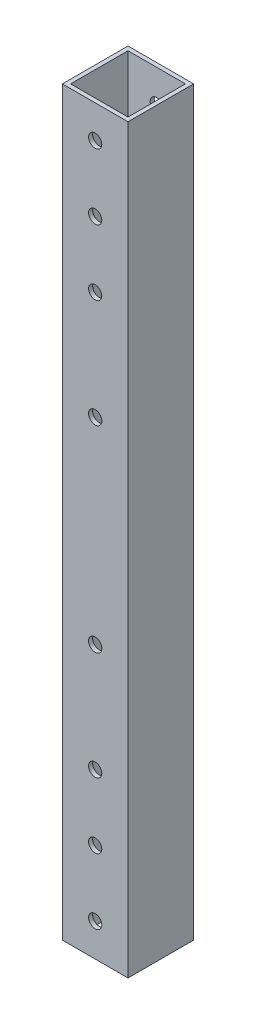
ISO-10303-21;
HEADER;
FILE_DESCRIPTION(('STEP AP214'),'2;1');
FILE_NAME('part.step','',(''),(''),'','','');
FILE_SCHEMA(('AUTOMOTIVE_DESIGN { 1 0 10303 214 1 1 1 1 }'));
ENDSEC;
DATA;
#1=APPLICATION_CONTEXT('core data for automotive mechanical design processes');
#2=APPLICATION_PROTOCOL_DEFINITION('international standard','automotive_design',2000,#1);
#3=PRODUCT_CONTEXT('',#1,'mechanical');
#4=PRODUCT('Part','Part','',(#3));
#5=PRODUCT_RELATED_PRODUCT_CATEGORY('part','',(#4));
#6=PRODUCT_DEFINITION_FORMATION('','',#4);
#7=PRODUCT_DEFINITION_CONTEXT('part definition',#1,'design');
#8=PRODUCT_DEFINITION('design','',#6,#7);
#9=PRODUCT_DEFINITION_SHAPE('','',#8);
#10=(LENGTH_UNIT() NAMED_UNIT(*) SI_UNIT(.MILLI.,.METRE.));
#11=(NAMED_UNIT(*) PLANE_ANGLE_UNIT() SI_UNIT($,.RADIAN.));
#12=(NAMED_UNIT(*) SI_UNIT($,.STERADIAN.) SOLID_ANGLE_UNIT());
#13=UNCERTAINTY_MEASURE_WITH_UNIT(LENGTH_MEASURE(1.E-05),#10,'distance_accuracy_value','');
#14=(GEOMETRIC_REPRESENTATION_CONTEXT(3) GLOBAL_UNCERTAINTY_ASSIGNED_CONTEXT((#13)) GLOBAL_UNIT_ASSIGNED_CONTEXT((#10,
#11,#12)) REPRESENTATION_CONTEXT('',''));
#15=CARTESIAN_POINT('',(0.,0.,0.));
#16=DIRECTION('',(0.,0.,1.));
#17=DIRECTION('',(1.,0.,0.));
#18=AXIS2_PLACEMENT_3D('',#15,#16,#17);
#19=CARTESIAN_POINT('',(0.,287.02,0.));
#20=DIRECTION('',(0.,1.,0.));
#21=DIRECTION('',(0.,0.,1.));
#22=AXIS2_PLACEMENT_3D('',#19,#20,#21);
#23=PLANE('',#22);
#24=DIRECTION('',(0.,0.,-1.));
#25=VECTOR('',#24,1.);
#26=CARTESIAN_POINT('',(12.7,287.02,-12.7));
#27=LINE('',#26,#25);
#28=CARTESIAN_POINT('',(12.7,287.02,12.7));
#29=VERTEX_POINT('',#28);
#30=CARTESIAN_POINT('',(12.7,287.02,-12.7));
#31=VERTEX_POINT('',#30);
#32=EDGE_CURVE('E145',#29,#31,#27,.T.);
#33=ORIENTED_EDGE('',*,*,#32,.T.);
#34=DIRECTION('',(-1.,0.,0.));
#35=VECTOR('',#34,1.);
#36=CARTESIAN_POINT('',(-12.7,287.02,-12.7));
#37=LINE('',#36,#35);
#38=CARTESIAN_POINT('',(-12.7,287.02,-12.7));
#39=VERTEX_POINT('',#38);
#40=EDGE_CURVE('E148',#31,#39,#37,.T.);
#41=ORIENTED_EDGE('',*,*,#40,.T.);
#42=DIRECTION('',(0.,0.,1.));
#43=VECTOR('',#42,1.);
#44=CARTESIAN_POINT('',(-12.7,287.02,-12.7));
#45=LINE('',#44,#43);
#46=CARTESIAN_POINT('',(-12.7,287.02,12.7));
#47=VERTEX_POINT('',#46);
#48=EDGE_CURVE('E151',#39,#47,#45,.T.);
#49=ORIENTED_EDGE('',*,*,#48,.T.);
#50=DIRECTION('',(1.,0.,0.));
#51=VECTOR('',#50,1.);
#52=CARTESIAN_POINT('',(-12.7,287.02,12.7));
#53=LINE('',#52,#51);
#54=EDGE_CURVE('E153',#47,#29,#53,.T.);
#55=ORIENTED_EDGE('',*,*,#54,.T.);
#56=EDGE_LOOP('',(#33,#41,#49,#55));
#57=FACE_BOUND('',#56,.T.);
#58=DIRECTION('',(-1.,0.,0.));
#59=VECTOR('',#58,1.);
#60=CARTESIAN_POINT('',(-11.1125,287.02,-11.1125));
#61=LINE('',#60,#59);
#62=CARTESIAN_POINT('',(11.1125,287.02,-11.1125));
#63=VERTEX_POINT('',#62);
#64=CARTESIAN_POINT('',(-11.1125,287.02,-11.1125));
#65=VERTEX_POINT('',#64);
#66=EDGE_CURVE('E115',#63,#65,#61,.T.);
#67=ORIENTED_EDGE('',*,*,#66,.F.);
#68=DIRECTION('',(0.,0.,-1.));
#69=VECTOR('',#68,1.);
#70=CARTESIAN_POINT('',(11.1125,287.02,-11.1125));
#71=LINE('',#70,#69);
#72=CARTESIAN_POINT('',(11.1125,287.02,11.1125));
#73=VERTEX_POINT('',#72);
#74=EDGE_CURVE('E107',#73,#63,#71,.T.);
#75=ORIENTED_EDGE('',*,*,#74,.F.);
#76=DIRECTION('',(1.,0.,0.));
#77=VECTOR('',#76,1.);
#78=CARTESIAN_POINT('',(-11.1125,287.02,11.1125));
#79=LINE('',#78,#77);
#80=CARTESIAN_POINT('',(-11.1125,287.02,11.1125));
#81=VERTEX_POINT('',#80);
#82=EDGE_CURVE('E129',#81,#73,#79,.T.);
#83=ORIENTED_EDGE('',*,*,#82,.F.);
#84=DIRECTION('',(0.,0.,1.));
#85=VECTOR('',#84,1.);
#86=CARTESIAN_POINT('',(-11.1125,287.02,-11.1125));
#87=LINE('',#86,#85);
#88=EDGE_CURVE('E127',#65,#81,#87,.T.);
#89=ORIENTED_EDGE('',*,*,#88,.F.);
#90=EDGE_LOOP('',(#67,#75,#83,#89));
#91=FACE_BOUND('',#90,.T.);
#92=ADVANCED_FACE('F40',(#57,#91),#23,.T.);
#93=CARTESIAN_POINT('',(0.,0.,0.));
#94=DIRECTION('',(0.,1.,0.));
#95=DIRECTION('',(0.,0.,1.));
#96=AXIS2_PLACEMENT_3D('',#93,#94,#95);
#97=PLANE('',#96);
#98=DIRECTION('',(0.,0.,-1.));
#99=VECTOR('',#98,1.);
#100=CARTESIAN_POINT('',(12.7,0.,-12.7));
#101=LINE('',#100,#99);
#102=CARTESIAN_POINT('',(12.7,0.,12.7));
#103=VERTEX_POINT('',#102);
#104=CARTESIAN_POINT('',(12.7,0.,-12.7));
#105=VERTEX_POINT('',#104);
#106=EDGE_CURVE('E123',#103,#105,#101,.T.);
#107=ORIENTED_EDGE('',*,*,#106,.F.);
#108=DIRECTION('',(1.,0.,0.));
#109=VECTOR('',#108,1.);
#110=CARTESIAN_POINT('',(-12.7,0.,12.7));
#111=LINE('',#110,#109);
#112=CARTESIAN_POINT('',(-12.7,0.,12.7));
#113=VERTEX_POINT('',#112);
#114=EDGE_CURVE('E149',#113,#103,#111,.T.);
#115=ORIENTED_EDGE('',*,*,#114,.F.);
#116=DIRECTION('',(0.,0.,1.));
#117=VECTOR('',#116,1.);
#118=CARTESIAN_POINT('',(-12.7,0.,-12.7));
#119=LINE('',#118,#117);
#120=CARTESIAN_POINT('',(-12.7,0.,-12.7));
#121=VERTEX_POINT('',#120);
#122=EDGE_CURVE('E160',#121,#113,#119,.T.);
#123=ORIENTED_EDGE('',*,*,#122,.F.);
#124=DIRECTION('',(-1.,0.,0.));
#125=VECTOR('',#124,1.);
#126=CARTESIAN_POINT('',(-12.7,0.,-12.7));
#127=LINE('',#126,#125);
#128=EDGE_CURVE('E158',#105,#121,#127,.T.);
#129=ORIENTED_EDGE('',*,*,#128,.F.);
#130=EDGE_LOOP('',(#107,#115,#123,#129));
#131=FACE_BOUND('',#130,.T.);
#132=DIRECTION('',(0.,0.,-1.));
#133=VECTOR('',#132,1.);
#134=CARTESIAN_POINT('',(11.1125,0.,-11.1125));
#135=LINE('',#134,#133);
#136=CARTESIAN_POINT('',(11.1125,0.,11.1125));
#137=VERTEX_POINT('',#136);
#138=CARTESIAN_POINT('',(11.1125,0.,-11.1125));
#139=VERTEX_POINT('',#138);
#140=EDGE_CURVE('E65',#137,#139,#135,.T.);
#141=ORIENTED_EDGE('',*,*,#140,.T.);
#142=DIRECTION('',(-1.,0.,0.));
#143=VECTOR('',#142,1.);
#144=CARTESIAN_POINT('',(-11.1125,0.,-11.1125));
#145=LINE('',#144,#143);
#146=CARTESIAN_POINT('',(-11.1125,0.,-11.1125));
#147=VERTEX_POINT('',#146);
#148=EDGE_CURVE('E122',#139,#147,#145,.T.);
#149=ORIENTED_EDGE('',*,*,#148,.T.);
#150=DIRECTION('',(0.,0.,1.));
#151=VECTOR('',#150,1.);
#152=CARTESIAN_POINT('',(-11.1125,0.,-11.1125));
#153=LINE('',#152,#151);
#154=CARTESIAN_POINT('',(-11.1125,0.,11.1125));
#155=VERTEX_POINT('',#154);
#156=EDGE_CURVE('E137',#147,#155,#153,.T.);
#157=ORIENTED_EDGE('',*,*,#156,.T.);
#158=DIRECTION('',(1.,0.,0.));
#159=VECTOR('',#158,1.);
#160=CARTESIAN_POINT('',(-11.1125,0.,11.1125));
#161=LINE('',#160,#159);
#162=EDGE_CURVE('E116',#155,#137,#161,.T.);
#163=ORIENTED_EDGE('',*,*,#162,.T.);
#164=EDGE_LOOP('',(#141,#149,#157,#163));
#165=FACE_BOUND('',#164,.T.);
#166=ADVANCED_FACE('F277',(#131,#165),#97,.F.);
#167=CARTESIAN_POINT('',(12.7,287.02,-12.7));
#168=DIRECTION('',(-1.,0.,0.));
#169=DIRECTION('',(0.,0.,1.));
#170=AXIS2_PLACEMENT_3D('',#167,#168,#169);
#171=PLANE('',#170);
#172=ORIENTED_EDGE('',*,*,#106,.T.);
#173=DIRECTION('',(0.,-1.,0.));
#174=VECTOR('',#173,1.);
#175=CARTESIAN_POINT('',(12.7,287.02,-12.7));
#176=LINE('',#175,#174);
#177=EDGE_CURVE('E11',#31,#105,#176,.T.);
#178=ORIENTED_EDGE('',*,*,#177,.F.);
#179=ORIENTED_EDGE('',*,*,#32,.F.);
#180=DIRECTION('',(0.,-1.,0.));
#181=VECTOR('',#180,1.);
#182=CARTESIAN_POINT('',(12.7,287.02,12.7));
#183=LINE('',#182,#181);
#184=EDGE_CURVE('E155',#29,#103,#183,.T.);
#185=ORIENTED_EDGE('',*,*,#184,.T.);
#186=EDGE_LOOP('',(#172,#178,#179,#185));
#187=FACE_BOUND('',#186,.T.);
#188=ADVANCED_FACE('F42',(#187),#171,.F.);
#189=CARTESIAN_POINT('',(-12.7,287.02,-12.7));
#190=DIRECTION('',(0.,0.,1.));
#191=DIRECTION('',(1.,0.,0.));
#192=AXIS2_PLACEMENT_3D('',#189,#190,#191);
#193=PLANE('',#192);
#194=CARTESIAN_POINT('',(1.11022302462516E-13,105.41,-12.7));
#195=DIRECTION('',(0.,0.,-1.));
#196=DIRECTION('',(-1.,0.,0.));
#197=AXIS2_PLACEMENT_3D('',#194,#195,#196);
#198=CIRCLE('',#197,2.57975099999999);
#199=CARTESIAN_POINT('',(-2.57975099999988,105.41,-12.7));
#200=VERTEX_POINT('',#199);
#201=EDGE_CURVE('E302',#200,#200,#198,.T.);
#202=ORIENTED_EDGE('',*,*,#201,.F.);
#203=EDGE_LOOP('',(#202));
#204=FACE_BOUND('',#203,.T.);
#205=CARTESIAN_POINT('',(1.11022302462516E-13,181.61,-12.7));
#206=DIRECTION('',(0.,0.,-1.));
#207=DIRECTION('',(-1.,0.,0.));
#208=AXIS2_PLACEMENT_3D('',#205,#206,#207);
#209=CIRCLE('',#208,2.57975099999999);
#210=CARTESIAN_POINT('',(-2.57975099999988,181.61,-12.7));
#211=VERTEX_POINT('',#210);
#212=EDGE_CURVE('E208',#211,#211,#209,.T.);
#213=ORIENTED_EDGE('',*,*,#212,.F.);
#214=EDGE_LOOP('',(#213));
#215=FACE_BOUND('',#214,.T.);
#216=CARTESIAN_POINT('',(0.,274.32,-12.7));
#217=DIRECTION('',(0.,0.,1.));
#218=DIRECTION('',(1.,0.,0.));
#219=AXIS2_PLACEMENT_3D('',#216,#217,#218);
#220=CIRCLE('',#219,2.5527);
#221=CARTESIAN_POINT('',(2.55269999999995,274.32,-12.7));
#222=VERTEX_POINT('',#221);
#223=EDGE_CURVE('E197',#222,#222,#220,.T.);
#224=ORIENTED_EDGE('',*,*,#223,.T.);
#225=EDGE_LOOP('',(#224));
#226=FACE_BOUND('',#225,.T.);
#227=CARTESIAN_POINT('',(0.,248.92,-12.7));
#228=DIRECTION('',(0.,0.,1.));
#229=DIRECTION('',(1.,0.,0.));
#230=AXIS2_PLACEMENT_3D('',#227,#228,#229);
#231=CIRCLE('',#230,2.5527);
#232=CARTESIAN_POINT('',(2.55269999999994,248.92,-12.7));
#233=VERTEX_POINT('',#232);
#234=EDGE_CURVE('E193',#233,#233,#231,.T.);
#235=ORIENTED_EDGE('',*,*,#234,.T.);
#236=EDGE_LOOP('',(#235));
#237=FACE_BOUND('',#236,.T.);
#238=CARTESIAN_POINT('',(0.,223.52,-12.7));
#239=DIRECTION('',(0.,0.,1.));
#240=DIRECTION('',(1.,0.,0.));
#241=AXIS2_PLACEMENT_3D('',#238,#239,#240);
#242=CIRCLE('',#241,2.5527);
#243=CARTESIAN_POINT('',(2.55269999999994,223.52,-12.7));
#244=VERTEX_POINT('',#243);
#245=EDGE_CURVE('E188',#244,#244,#242,.T.);
#246=ORIENTED_EDGE('',*,*,#245,.T.);
#247=EDGE_LOOP('',(#246));
#248=FACE_BOUND('',#247,.T.);
#249=CARTESIAN_POINT('',(0.,63.5,-12.7));
#250=DIRECTION('',(0.,0.,1.));
#251=DIRECTION('',(1.,0.,0.));
#252=AXIS2_PLACEMENT_3D('',#249,#250,#251);
#253=CIRCLE('',#252,2.5527);
#254=CARTESIAN_POINT('',(2.55270000000001,63.5,-12.7));
#255=VERTEX_POINT('',#254);
#256=EDGE_CURVE('E183',#255,#255,#253,.T.);
#257=ORIENTED_EDGE('',*,*,#256,.T.);
#258=EDGE_LOOP('',(#257));
#259=FACE_BOUND('',#258,.T.);
#260=CARTESIAN_POINT('',(0.,38.1,-12.7));
#261=DIRECTION('',(0.,0.,1.));
#262=DIRECTION('',(1.,0.,0.));
#263=AXIS2_PLACEMENT_3D('',#260,#261,#262);
#264=CIRCLE('',#263,2.5527);
#265=CARTESIAN_POINT('',(2.55270000000001,38.1,-12.7));
#266=VERTEX_POINT('',#265);
#267=EDGE_CURVE('E178',#266,#266,#264,.T.);
#268=ORIENTED_EDGE('',*,*,#267,.T.);
#269=EDGE_LOOP('',(#268));
#270=FACE_BOUND('',#269,.T.);
#271=CARTESIAN_POINT('',(0.,12.7,-12.7));
#272=DIRECTION('',(0.,0.,1.));
#273=DIRECTION('',(1.,0.,0.));
#274=AXIS2_PLACEMENT_3D('',#271,#272,#273);
#275=CIRCLE('',#274,2.5527);
#276=CARTESIAN_POINT('',(2.55270000000001,12.7,-12.7));
#277=VERTEX_POINT('',#276);
#278=EDGE_CURVE('E173',#277,#277,#275,.T.);
#279=ORIENTED_EDGE('',*,*,#278,.T.);
#280=EDGE_LOOP('',(#279));
#281=FACE_BOUND('',#280,.T.);
#282=ORIENTED_EDGE('',*,*,#128,.T.);
#283=DIRECTION('',(0.,-1.,0.));
#284=VECTOR('',#283,1.);
#285=CARTESIAN_POINT('',(-12.7,287.02,-12.7));
#286=LINE('',#285,#284);
#287=EDGE_CURVE('E49',#39,#121,#286,.T.);
#288=ORIENTED_EDGE('',*,*,#287,.F.);
#289=ORIENTED_EDGE('',*,*,#40,.F.);
#290=ORIENTED_EDGE('',*,*,#177,.T.);
#291=EDGE_LOOP('',(#282,#288,#289,#290));
#292=FACE_BOUND('',#291,.T.);
#293=ADVANCED_FACE('F291',(#204,#215,#226,#237,#248,#259,#270,#281,#292),#193,.F.);
#294=CARTESIAN_POINT('',(-12.7,287.02,-12.7));
#295=DIRECTION('',(1.,0.,0.));
#296=DIRECTION('',(0.,0.,-1.));
#297=AXIS2_PLACEMENT_3D('',#294,#295,#296);
#298=PLANE('',#297);
#299=ORIENTED_EDGE('',*,*,#122,.T.);
#300=DIRECTION('',(0.,-1.,0.));
#301=VECTOR('',#300,1.);
#302=CARTESIAN_POINT('',(-12.7,287.02,12.7));
#303=LINE('',#302,#301);
#304=EDGE_CURVE('E165',#47,#113,#303,.T.);
#305=ORIENTED_EDGE('',*,*,#304,.F.);
#306=ORIENTED_EDGE('',*,*,#48,.F.);
#307=ORIENTED_EDGE('',*,*,#287,.T.);
#308=EDGE_LOOP('',(#299,#305,#306,#307));
#309=FACE_BOUND('',#308,.T.);
#310=ADVANCED_FACE('F288',(#309),#298,.F.);
#311=CARTESIAN_POINT('',(-12.7,287.02,12.7));
#312=DIRECTION('',(0.,0.,-1.));
#313=DIRECTION('',(-1.,0.,0.));
#314=AXIS2_PLACEMENT_3D('',#311,#312,#313);
#315=PLANE('',#314);
#316=CARTESIAN_POINT('',(1.11022302462516E-13,105.41,12.7));
#317=DIRECTION('',(0.,0.,-1.));
#318=DIRECTION('',(-1.,0.,0.));
#319=AXIS2_PLACEMENT_3D('',#316,#317,#318);
#320=CIRCLE('',#319,2.57975099999993);
#321=CARTESIAN_POINT('',(-2.57975099999982,105.41,12.7));
#322=VERTEX_POINT('',#321);
#323=EDGE_CURVE('E385',#322,#322,#320,.T.);
#324=ORIENTED_EDGE('',*,*,#323,.T.);
#325=EDGE_LOOP('',(#324));
#326=FACE_BOUND('',#325,.T.);
#327=CARTESIAN_POINT('',(1.11022302462516E-13,181.61,12.7));
#328=DIRECTION('',(0.,0.,-1.));
#329=DIRECTION('',(-1.,0.,0.));
#330=AXIS2_PLACEMENT_3D('',#327,#328,#329);
#331=CIRCLE('',#330,2.57975099999993);
#332=CARTESIAN_POINT('',(-2.57975099999982,181.61,12.7));
#333=VERTEX_POINT('',#332);
#334=EDGE_CURVE('E201',#333,#333,#331,.T.);
#335=ORIENTED_EDGE('',*,*,#334,.T.);
#336=EDGE_LOOP('',(#335));
#337=FACE_BOUND('',#336,.T.);
#338=CARTESIAN_POINT('',(0.,274.32,12.7));
#339=DIRECTION('',(0.,0.,1.));
#340=DIRECTION('',(1.,0.,0.));
#341=AXIS2_PLACEMENT_3D('',#338,#339,#340);
#342=CIRCLE('',#341,2.55269999999999);
#343=CARTESIAN_POINT('',(2.55269999999994,274.32,12.7));
#344=VERTEX_POINT('',#343);
#345=EDGE_CURVE('E205',#344,#344,#342,.T.);
#346=ORIENTED_EDGE('',*,*,#345,.F.);
#347=EDGE_LOOP('',(#346));
#348=FACE_BOUND('',#347,.T.);
#349=CARTESIAN_POINT('',(0.,248.92,12.7));
#350=DIRECTION('',(0.,0.,1.));
#351=DIRECTION('',(1.,0.,0.));
#352=AXIS2_PLACEMENT_3D('',#349,#350,#351);
#353=CIRCLE('',#352,2.55269999999999);
#354=CARTESIAN_POINT('',(2.55269999999993,248.92,12.7));
#355=VERTEX_POINT('',#354);
#356=EDGE_CURVE('E223',#355,#355,#353,.T.);
#357=ORIENTED_EDGE('',*,*,#356,.F.);
#358=EDGE_LOOP('',(#357));
#359=FACE_BOUND('',#358,.T.);
#360=CARTESIAN_POINT('',(0.,223.52,12.7));
#361=DIRECTION('',(0.,0.,1.));
#362=DIRECTION('',(1.,0.,0.));
#363=AXIS2_PLACEMENT_3D('',#360,#361,#362);
#364=CIRCLE('',#363,2.55269999999999);
#365=CARTESIAN_POINT('',(2.55269999999993,223.52,12.7));
#366=VERTEX_POINT('',#365);
#367=EDGE_CURVE('E230',#366,#366,#364,.T.);
#368=ORIENTED_EDGE('',*,*,#367,.F.);
#369=EDGE_LOOP('',(#368));
#370=FACE_BOUND('',#369,.T.);
#371=CARTESIAN_POINT('',(0.,63.5,12.7));
#372=DIRECTION('',(0.,0.,1.));
#373=DIRECTION('',(1.,0.,0.));
#374=AXIS2_PLACEMENT_3D('',#371,#372,#373);
#375=CIRCLE('',#374,2.55269999999999);
#376=CARTESIAN_POINT('',(2.5527,63.5,12.7));
#377=VERTEX_POINT('',#376);
#378=EDGE_CURVE('E237',#377,#377,#375,.T.);
#379=ORIENTED_EDGE('',*,*,#378,.F.);
#380=EDGE_LOOP('',(#379));
#381=FACE_BOUND('',#380,.T.);
#382=CARTESIAN_POINT('',(0.,38.1,12.7));
#383=DIRECTION('',(0.,0.,1.));
#384=DIRECTION('',(1.,0.,0.));
#385=AXIS2_PLACEMENT_3D('',#382,#383,#384);
#386=CIRCLE('',#385,2.55269999999999);
#387=CARTESIAN_POINT('',(2.5527,38.1,12.7));
#388=VERTEX_POINT('',#387);
#389=EDGE_CURVE('E244',#388,#388,#386,.T.);
#390=ORIENTED_EDGE('',*,*,#389,.F.);
#391=EDGE_LOOP('',(#390));
#392=FACE_BOUND('',#391,.T.);
#393=CARTESIAN_POINT('',(0.,12.7,12.7));
#394=DIRECTION('',(0.,0.,1.));
#395=DIRECTION('',(1.,0.,0.));
#396=AXIS2_PLACEMENT_3D('',#393,#394,#395);
#397=CIRCLE('',#396,2.55269999999999);
#398=CARTESIAN_POINT('',(2.5527,12.7,12.7));
#399=VERTEX_POINT('',#398);
#400=EDGE_CURVE('E251',#399,#399,#397,.T.);
#401=ORIENTED_EDGE('',*,*,#400,.F.);
#402=EDGE_LOOP('',(#401));
#403=FACE_BOUND('',#402,.T.);
#404=ORIENTED_EDGE('',*,*,#114,.T.);
#405=ORIENTED_EDGE('',*,*,#184,.F.);
#406=ORIENTED_EDGE('',*,*,#54,.F.);
#407=ORIENTED_EDGE('',*,*,#304,.T.);
#408=EDGE_LOOP('',(#404,#405,#406,#407));
#409=FACE_BOUND('',#408,.T.);
#410=ADVANCED_FACE('F272',(#326,#337,#348,#359,#370,#381,#392,#403,#409),#315,.F.);
#411=CARTESIAN_POINT('',(11.1125,287.02,-11.1125));
#412=DIRECTION('',(-1.,0.,0.));
#413=DIRECTION('',(0.,0.,1.));
#414=AXIS2_PLACEMENT_3D('',#411,#412,#413);
#415=PLANE('',#414);
#416=ORIENTED_EDGE('',*,*,#140,.F.);
#417=DIRECTION('',(0.,-1.,0.));
#418=VECTOR('',#417,1.);
#419=CARTESIAN_POINT('',(11.1125,287.02,11.1125));
#420=LINE('',#419,#418);
#421=EDGE_CURVE('E111',#73,#137,#420,.T.);
#422=ORIENTED_EDGE('',*,*,#421,.F.);
#423=ORIENTED_EDGE('',*,*,#74,.T.);
#424=DIRECTION('',(0.,-1.,0.));
#425=VECTOR('',#424,1.);
#426=CARTESIAN_POINT('',(11.1125,287.02,-11.1125));
#427=LINE('',#426,#425);
#428=EDGE_CURVE('E110',#63,#139,#427,.T.);
#429=ORIENTED_EDGE('',*,*,#428,.T.);
#430=EDGE_LOOP('',(#416,#422,#423,#429));
#431=FACE_BOUND('',#430,.T.);
#432=ADVANCED_FACE('F109',(#431),#415,.T.);
#433=CARTESIAN_POINT('',(-11.1125,287.02,-11.1125));
#434=DIRECTION('',(0.,0.,1.));
#435=DIRECTION('',(1.,0.,0.));
#436=AXIS2_PLACEMENT_3D('',#433,#434,#435);
#437=PLANE('',#436);
#438=CARTESIAN_POINT('',(1.11022302462516E-13,105.41,-11.1125));
#439=DIRECTION('',(0.,0.,1.));
#440=DIRECTION('',(1.,0.,0.));
#441=AXIS2_PLACEMENT_3D('',#438,#439,#440);
#442=CIRCLE('',#441,2.57975099999996);
#443=CARTESIAN_POINT('',(2.57975100000007,105.41,-11.1125));
#444=VERTEX_POINT('',#443);
#445=EDGE_CURVE('E213',#444,#444,#442,.T.);
#446=ORIENTED_EDGE('',*,*,#445,.F.);
#447=EDGE_LOOP('',(#446));
#448=FACE_BOUND('',#447,.T.);
#449=CARTESIAN_POINT('',(1.11022302462516E-13,181.61,-11.1125));
#450=DIRECTION('',(0.,0.,1.));
#451=DIRECTION('',(1.,0.,0.));
#452=AXIS2_PLACEMENT_3D('',#449,#450,#451);
#453=CIRCLE('',#452,2.57975099999996);
#454=CARTESIAN_POINT('',(2.57975100000007,181.61,-11.1125));
#455=VERTEX_POINT('',#454);
#456=EDGE_CURVE('E200',#455,#455,#453,.T.);
#457=ORIENTED_EDGE('',*,*,#456,.F.);
#458=EDGE_LOOP('',(#457));
#459=FACE_BOUND('',#458,.T.);
#460=CARTESIAN_POINT('',(0.,274.32,-11.1125));
#461=DIRECTION('',(0.,0.,1.));
#462=DIRECTION('',(1.,0.,0.));
#463=AXIS2_PLACEMENT_3D('',#460,#461,#462);
#464=CIRCLE('',#463,2.55269999999999);
#465=CARTESIAN_POINT('',(2.55269999999994,274.32,-11.1125));
#466=VERTEX_POINT('',#465);
#467=EDGE_CURVE('E196',#466,#466,#464,.T.);
#468=ORIENTED_EDGE('',*,*,#467,.F.);
#469=EDGE_LOOP('',(#468));
#470=FACE_BOUND('',#469,.T.);
#471=CARTESIAN_POINT('',(0.,248.92,-11.1125));
#472=DIRECTION('',(0.,0.,1.));
#473=DIRECTION('',(1.,0.,0.));
#474=AXIS2_PLACEMENT_3D('',#471,#472,#473);
#475=CIRCLE('',#474,2.55269999999999);
#476=CARTESIAN_POINT('',(2.55269999999993,248.92,-11.1125));
#477=VERTEX_POINT('',#476);
#478=EDGE_CURVE('E192',#477,#477,#475,.T.);
#479=ORIENTED_EDGE('',*,*,#478,.F.);
#480=EDGE_LOOP('',(#479));
#481=FACE_BOUND('',#480,.T.);
#482=CARTESIAN_POINT('',(0.,223.52,-11.1125));
#483=DIRECTION('',(0.,0.,1.));
#484=DIRECTION('',(1.,0.,0.));
#485=AXIS2_PLACEMENT_3D('',#482,#483,#484);
#486=CIRCLE('',#485,2.55269999999999);
#487=CARTESIAN_POINT('',(2.55269999999994,223.52,-11.1125));
#488=VERTEX_POINT('',#487);
#489=EDGE_CURVE('E187',#488,#488,#486,.T.);
#490=ORIENTED_EDGE('',*,*,#489,.F.);
#491=EDGE_LOOP('',(#490));
#492=FACE_BOUND('',#491,.T.);
#493=CARTESIAN_POINT('',(0.,63.5,-11.1125));
#494=DIRECTION('',(0.,0.,1.));
#495=DIRECTION('',(1.,0.,0.));
#496=AXIS2_PLACEMENT_3D('',#493,#494,#495);
#497=CIRCLE('',#496,2.55269999999999);
#498=CARTESIAN_POINT('',(2.55270000000001,63.5,-11.1125));
#499=VERTEX_POINT('',#498);
#500=EDGE_CURVE('E179',#499,#499,#497,.T.);
#501=ORIENTED_EDGE('',*,*,#500,.F.);
#502=EDGE_LOOP('',(#501));
#503=FACE_BOUND('',#502,.T.);
#504=CARTESIAN_POINT('',(0.,38.1,-11.1125));
#505=DIRECTION('',(0.,0.,1.));
#506=DIRECTION('',(1.,0.,0.));
#507=AXIS2_PLACEMENT_3D('',#504,#505,#506);
#508=CIRCLE('',#507,2.55269999999999);
#509=CARTESIAN_POINT('',(2.5527,38.1,-11.1125));
#510=VERTEX_POINT('',#509);
#511=EDGE_CURVE('E177',#510,#510,#508,.T.);
#512=ORIENTED_EDGE('',*,*,#511,.F.);
#513=EDGE_LOOP('',(#512));
#514=FACE_BOUND('',#513,.T.);
#515=CARTESIAN_POINT('',(0.,12.7,-11.1125));
#516=DIRECTION('',(0.,0.,1.));
#517=DIRECTION('',(1.,0.,0.));
#518=AXIS2_PLACEMENT_3D('',#515,#516,#517);
#519=CIRCLE('',#518,2.55269999999999);
#520=CARTESIAN_POINT('',(2.5527,12.7,-11.1125));
#521=VERTEX_POINT('',#520);
#522=EDGE_CURVE('E135',#521,#521,#519,.T.);
#523=ORIENTED_EDGE('',*,*,#522,.F.);
#524=EDGE_LOOP('',(#523));
#525=FACE_BOUND('',#524,.T.);
#526=ORIENTED_EDGE('',*,*,#148,.F.);
#527=ORIENTED_EDGE('',*,*,#428,.F.);
#528=ORIENTED_EDGE('',*,*,#66,.T.);
#529=DIRECTION('',(0.,-1.,0.));
#530=VECTOR('',#529,1.);
#531=CARTESIAN_POINT('',(-11.1125,287.02,-11.1125));
#532=LINE('',#531,#530);
#533=EDGE_CURVE('E124',#65,#147,#532,.T.);
#534=ORIENTED_EDGE('',*,*,#533,.T.);
#535=EDGE_LOOP('',(#526,#527,#528,#534));
#536=FACE_BOUND('',#535,.T.);
#537=ADVANCED_FACE('F119',(#448,#459,#470,#481,#492,#503,#514,#525,#536),#437,.T.);
#538=CARTESIAN_POINT('',(-11.1125,287.02,-11.1125));
#539=DIRECTION('',(1.,0.,0.));
#540=DIRECTION('',(0.,0.,-1.));
#541=AXIS2_PLACEMENT_3D('',#538,#539,#540);
#542=PLANE('',#541);
#543=ORIENTED_EDGE('',*,*,#156,.F.);
#544=ORIENTED_EDGE('',*,*,#533,.F.);
#545=ORIENTED_EDGE('',*,*,#88,.T.);
#546=DIRECTION('',(0.,-1.,0.));
#547=VECTOR('',#546,1.);
#548=CARTESIAN_POINT('',(-11.1125,287.02,11.1125));
#549=LINE('',#548,#547);
#550=EDGE_CURVE('E57',#81,#155,#549,.T.);
#551=ORIENTED_EDGE('',*,*,#550,.T.);
#552=EDGE_LOOP('',(#543,#544,#545,#551));
#553=FACE_BOUND('',#552,.T.);
#554=ADVANCED_FACE('F262',(#553),#542,.T.);
#555=CARTESIAN_POINT('',(-11.1125,287.02,11.1125));
#556=DIRECTION('',(0.,0.,-1.));
#557=DIRECTION('',(-1.,0.,0.));
#558=AXIS2_PLACEMENT_3D('',#555,#556,#557);
#559=PLANE('',#558);
#560=CARTESIAN_POINT('',(1.11022302462516E-13,105.41,11.1125));
#561=DIRECTION('',(0.,0.,-1.));
#562=DIRECTION('',(-1.,0.,0.));
#563=AXIS2_PLACEMENT_3D('',#560,#561,#562);
#564=CIRCLE('',#563,2.57975099999996);
#565=CARTESIAN_POINT('',(-2.57975099999985,105.41,11.1125));
#566=VERTEX_POINT('',#565);
#567=EDGE_CURVE('E44',#566,#566,#564,.T.);
#568=ORIENTED_EDGE('',*,*,#567,.F.);
#569=EDGE_LOOP('',(#568));
#570=FACE_BOUND('',#569,.T.);
#571=CARTESIAN_POINT('',(1.11022302462516E-13,181.61,11.1125));
#572=DIRECTION('',(0.,0.,-1.));
#573=DIRECTION('',(-1.,0.,0.));
#574=AXIS2_PLACEMENT_3D('',#571,#572,#573);
#575=CIRCLE('',#574,2.57975099999996);
#576=CARTESIAN_POINT('',(-2.57975099999985,181.61,11.1125));
#577=VERTEX_POINT('',#576);
#578=EDGE_CURVE('E198',#577,#577,#575,.T.);
#579=ORIENTED_EDGE('',*,*,#578,.F.);
#580=EDGE_LOOP('',(#579));
#581=FACE_BOUND('',#580,.T.);
#582=CARTESIAN_POINT('',(0.,274.32,11.1125));
#583=DIRECTION('',(0.,0.,-1.));
#584=DIRECTION('',(-1.,0.,0.));
#585=AXIS2_PLACEMENT_3D('',#582,#583,#584);
#586=CIRCLE('',#585,2.55269999999999);
#587=CARTESIAN_POINT('',(-2.55270000000004,274.32,11.1125));
#588=VERTEX_POINT('',#587);
#589=EDGE_CURVE('E194',#588,#588,#586,.T.);
#590=ORIENTED_EDGE('',*,*,#589,.F.);
#591=EDGE_LOOP('',(#590));
#592=FACE_BOUND('',#591,.T.);
#593=CARTESIAN_POINT('',(0.,248.92,11.1125));
#594=DIRECTION('',(0.,0.,-1.));
#595=DIRECTION('',(-1.,0.,0.));
#596=AXIS2_PLACEMENT_3D('',#593,#594,#595);
#597=CIRCLE('',#596,2.55269999999999);
#598=CARTESIAN_POINT('',(-2.55270000000005,248.92,11.1125));
#599=VERTEX_POINT('',#598);
#600=EDGE_CURVE('E189',#599,#599,#597,.T.);
#601=ORIENTED_EDGE('',*,*,#600,.F.);
#602=EDGE_LOOP('',(#601));
#603=FACE_BOUND('',#602,.T.);
#604=CARTESIAN_POINT('',(0.,223.52,11.1125));
#605=DIRECTION('',(0.,0.,-1.));
#606=DIRECTION('',(-1.,0.,0.));
#607=AXIS2_PLACEMENT_3D('',#604,#605,#606);
#608=CIRCLE('',#607,2.55269999999999);
#609=CARTESIAN_POINT('',(-2.55270000000005,223.52,11.1125));
#610=VERTEX_POINT('',#609);
#611=EDGE_CURVE('E184',#610,#610,#608,.T.);
#612=ORIENTED_EDGE('',*,*,#611,.F.);
#613=EDGE_LOOP('',(#612));
#614=FACE_BOUND('',#613,.T.);
#615=CARTESIAN_POINT('',(0.,63.5,11.1125));
#616=DIRECTION('',(0.,0.,-1.));
#617=DIRECTION('',(-1.,0.,0.));
#618=AXIS2_PLACEMENT_3D('',#615,#616,#617);
#619=CIRCLE('',#618,2.55269999999999);
#620=CARTESIAN_POINT('',(-2.55269999999998,63.5,11.1125));
#621=VERTEX_POINT('',#620);
#622=EDGE_CURVE('E182',#621,#621,#619,.T.);
#623=ORIENTED_EDGE('',*,*,#622,.F.);
#624=EDGE_LOOP('',(#623));
#625=FACE_BOUND('',#624,.T.);
#626=CARTESIAN_POINT('',(0.,38.1,11.1125));
#627=DIRECTION('',(0.,0.,-1.));
#628=DIRECTION('',(-1.,0.,0.));
#629=AXIS2_PLACEMENT_3D('',#626,#627,#628);
#630=CIRCLE('',#629,2.55269999999999);
#631=CARTESIAN_POINT('',(-2.55269999999998,38.1,11.1125));
#632=VERTEX_POINT('',#631);
#633=EDGE_CURVE('E174',#632,#632,#630,.T.);
#634=ORIENTED_EDGE('',*,*,#633,.F.);
#635=EDGE_LOOP('',(#634));
#636=FACE_BOUND('',#635,.T.);
#637=CARTESIAN_POINT('',(0.,12.7,11.1125));
#638=DIRECTION('',(0.,0.,-1.));
#639=DIRECTION('',(-1.,0.,0.));
#640=AXIS2_PLACEMENT_3D('',#637,#638,#639);
#641=CIRCLE('',#640,2.55269999999999);
#642=CARTESIAN_POINT('',(-2.55269999999998,12.7,11.1125));
#643=VERTEX_POINT('',#642);
#644=EDGE_CURVE('E170',#643,#643,#641,.T.);
#645=ORIENTED_EDGE('',*,*,#644,.F.);
#646=EDGE_LOOP('',(#645));
#647=FACE_BOUND('',#646,.T.);
#648=ORIENTED_EDGE('',*,*,#162,.F.);
#649=ORIENTED_EDGE('',*,*,#550,.F.);
#650=ORIENTED_EDGE('',*,*,#82,.T.);
#651=ORIENTED_EDGE('',*,*,#421,.T.);
#652=EDGE_LOOP('',(#648,#649,#650,#651));
#653=FACE_BOUND('',#652,.T.);
#654=ADVANCED_FACE('F269',(#570,#581,#592,#603,#614,#625,#636,#647,#653),#559,.T.);
#655=CARTESIAN_POINT('',(0.,12.7,12.7));
#656=DIRECTION('',(0.,0.,1.));
#657=DIRECTION('',(1.,0.,0.));
#658=AXIS2_PLACEMENT_3D('',#655,#656,#657);
#659=CYLINDRICAL_SURFACE('',#658,2.55269999999999);
#660=ORIENTED_EDGE('',*,*,#644,.T.);
#661=EDGE_LOOP('',(#660));
#662=FACE_BOUND('',#661,.T.);
#663=ORIENTED_EDGE('',*,*,#400,.T.);
#664=EDGE_LOOP('',(#663));
#665=FACE_BOUND('',#664,.T.);
#666=ADVANCED_FACE('F331',(#662,#665),#659,.F.);
#667=ORIENTED_EDGE('',*,*,#522,.T.);
#668=EDGE_LOOP('',(#667));
#669=FACE_BOUND('',#668,.T.);
#670=ORIENTED_EDGE('',*,*,#278,.F.);
#671=EDGE_LOOP('',(#670));
#672=FACE_BOUND('',#671,.T.);
#673=ADVANCED_FACE('F258',(#669,#672),#659,.F.);
#674=CARTESIAN_POINT('',(0.,38.1,12.7));
#675=DIRECTION('',(0.,0.,1.));
#676=DIRECTION('',(1.,0.,0.));
#677=AXIS2_PLACEMENT_3D('',#674,#675,#676);
#678=CYLINDRICAL_SURFACE('',#677,2.55269999999999);
#679=ORIENTED_EDGE('',*,*,#633,.T.);
#680=EDGE_LOOP('',(#679));
#681=FACE_BOUND('',#680,.T.);
#682=ORIENTED_EDGE('',*,*,#389,.T.);
#683=EDGE_LOOP('',(#682));
#684=FACE_BOUND('',#683,.T.);
#685=ADVANCED_FACE('F342',(#681,#684),#678,.F.);
#686=ORIENTED_EDGE('',*,*,#511,.T.);
#687=EDGE_LOOP('',(#686));
#688=FACE_BOUND('',#687,.T.);
#689=ORIENTED_EDGE('',*,*,#267,.F.);
#690=EDGE_LOOP('',(#689));
#691=FACE_BOUND('',#690,.T.);
#692=ADVANCED_FACE('F345',(#688,#691),#678,.F.);
#693=CARTESIAN_POINT('',(0.,63.5,12.7));
#694=DIRECTION('',(0.,0.,1.));
#695=DIRECTION('',(1.,0.,0.));
#696=AXIS2_PLACEMENT_3D('',#693,#694,#695);
#697=CYLINDRICAL_SURFACE('',#696,2.55269999999999);
#698=ORIENTED_EDGE('',*,*,#500,.T.);
#699=EDGE_LOOP('',(#698));
#700=FACE_BOUND('',#699,.T.);
#701=ORIENTED_EDGE('',*,*,#256,.F.);
#702=EDGE_LOOP('',(#701));
#703=FACE_BOUND('',#702,.T.);
#704=ADVANCED_FACE('F347',(#700,#703),#697,.F.);
#705=ORIENTED_EDGE('',*,*,#622,.T.);
#706=EDGE_LOOP('',(#705));
#707=FACE_BOUND('',#706,.T.);
#708=ORIENTED_EDGE('',*,*,#378,.T.);
#709=EDGE_LOOP('',(#708));
#710=FACE_BOUND('',#709,.T.);
#711=ADVANCED_FACE('F350',(#707,#710),#697,.F.);
#712=CARTESIAN_POINT('',(0.,223.52,12.7));
#713=DIRECTION('',(0.,0.,1.));
#714=DIRECTION('',(1.,0.,0.));
#715=AXIS2_PLACEMENT_3D('',#712,#713,#714);
#716=CYLINDRICAL_SURFACE('',#715,2.55269999999999);
#717=ORIENTED_EDGE('',*,*,#611,.T.);
#718=EDGE_LOOP('',(#717));
#719=FACE_BOUND('',#718,.T.);
#720=ORIENTED_EDGE('',*,*,#367,.T.);
#721=EDGE_LOOP('',(#720));
#722=FACE_BOUND('',#721,.T.);
#723=ADVANCED_FACE('F352',(#719,#722),#716,.F.);
#724=ORIENTED_EDGE('',*,*,#489,.T.);
#725=EDGE_LOOP('',(#724));
#726=FACE_BOUND('',#725,.T.);
#727=ORIENTED_EDGE('',*,*,#245,.F.);
#728=EDGE_LOOP('',(#727));
#729=FACE_BOUND('',#728,.T.);
#730=ADVANCED_FACE('F355',(#726,#729),#716,.F.);
#731=CARTESIAN_POINT('',(0.,248.92,12.7));
#732=DIRECTION('',(0.,0.,1.));
#733=DIRECTION('',(1.,0.,0.));
#734=AXIS2_PLACEMENT_3D('',#731,#732,#733);
#735=CYLINDRICAL_SURFACE('',#734,2.55269999999999);
#736=ORIENTED_EDGE('',*,*,#600,.T.);
#737=EDGE_LOOP('',(#736));
#738=FACE_BOUND('',#737,.T.);
#739=ORIENTED_EDGE('',*,*,#356,.T.);
#740=EDGE_LOOP('',(#739));
#741=FACE_BOUND('',#740,.T.);
#742=ADVANCED_FACE('F357',(#738,#741),#735,.F.);
#743=ORIENTED_EDGE('',*,*,#478,.T.);
#744=EDGE_LOOP('',(#743));
#745=FACE_BOUND('',#744,.T.);
#746=ORIENTED_EDGE('',*,*,#234,.F.);
#747=EDGE_LOOP('',(#746));
#748=FACE_BOUND('',#747,.T.);
#749=ADVANCED_FACE('F360',(#745,#748),#735,.F.);
#750=CARTESIAN_POINT('',(0.,274.32,12.7));
#751=DIRECTION('',(0.,0.,1.));
#752=DIRECTION('',(1.,0.,0.));
#753=AXIS2_PLACEMENT_3D('',#750,#751,#752);
#754=CYLINDRICAL_SURFACE('',#753,2.55269999999999);
#755=ORIENTED_EDGE('',*,*,#589,.T.);
#756=EDGE_LOOP('',(#755));
#757=FACE_BOUND('',#756,.T.);
#758=ORIENTED_EDGE('',*,*,#345,.T.);
#759=EDGE_LOOP('',(#758));
#760=FACE_BOUND('',#759,.T.);
#761=ADVANCED_FACE('F362',(#757,#760),#754,.F.);
#762=ORIENTED_EDGE('',*,*,#467,.T.);
#763=EDGE_LOOP('',(#762));
#764=FACE_BOUND('',#763,.T.);
#765=ORIENTED_EDGE('',*,*,#223,.F.);
#766=EDGE_LOOP('',(#765));
#767=FACE_BOUND('',#766,.T.);
#768=ADVANCED_FACE('F365',(#764,#767),#754,.F.);
#769=CARTESIAN_POINT('',(1.11022302462516E-13,181.61,-12.7));
#770=DIRECTION('',(0.,0.,-1.));
#771=DIRECTION('',(-1.,0.,0.));
#772=AXIS2_PLACEMENT_3D('',#769,#770,#771);
#773=CYLINDRICAL_SURFACE('',#772,2.57975099999996);
#774=ORIENTED_EDGE('',*,*,#578,.T.);
#775=EDGE_LOOP('',(#774));
#776=FACE_BOUND('',#775,.T.);
#777=ORIENTED_EDGE('',*,*,#334,.F.);
#778=EDGE_LOOP('',(#777));
#779=FACE_BOUND('',#778,.T.);
#780=ADVANCED_FACE('F367',(#776,#779),#773,.F.);
#781=ORIENTED_EDGE('',*,*,#456,.T.);
#782=EDGE_LOOP('',(#781));
#783=FACE_BOUND('',#782,.T.);
#784=ORIENTED_EDGE('',*,*,#212,.T.);
#785=EDGE_LOOP('',(#784));
#786=FACE_BOUND('',#785,.T.);
#787=ADVANCED_FACE('F370',(#783,#786),#773,.F.);
#788=CARTESIAN_POINT('',(1.11022302462516E-13,105.41,-12.7));
#789=DIRECTION('',(0.,0.,-1.));
#790=DIRECTION('',(-1.,0.,0.));
#791=AXIS2_PLACEMENT_3D('',#788,#789,#790);
#792=CYLINDRICAL_SURFACE('',#791,2.57975099999996);
#793=ORIENTED_EDGE('',*,*,#567,.T.);
#794=EDGE_LOOP('',(#793));
#795=FACE_BOUND('',#794,.T.);
#796=ORIENTED_EDGE('',*,*,#323,.F.);
#797=EDGE_LOOP('',(#796));
#798=FACE_BOUND('',#797,.T.);
#799=ADVANCED_FACE('F371',(#795,#798),#792,.F.);
#800=ORIENTED_EDGE('',*,*,#445,.T.);
#801=EDGE_LOOP('',(#800));
#802=FACE_BOUND('',#801,.T.);
#803=ORIENTED_EDGE('',*,*,#201,.T.);
#804=EDGE_LOOP('',(#803));
#805=FACE_BOUND('',#804,.T.);
#806=ADVANCED_FACE('F373',(#802,#805),#792,.F.);
#807=CLOSED_SHELL('',(#92,#166,#188,#293,#310,#410,#432,#537,#554,#654,#666,#673,#685,#692,#704,
#711,#723,#730,#742,#749,#761,#768,#780,#787,#799,#806));
#808=MANIFOLD_SOLID_BREP('B2',#807);
#809=ADVANCED_BREP_SHAPE_REPRESENTATION('',(#18,#808),#14);
#810=SHAPE_DEFINITION_REPRESENTATION(#9,#809);
ENDSEC;
END-ISO-10303-21;
